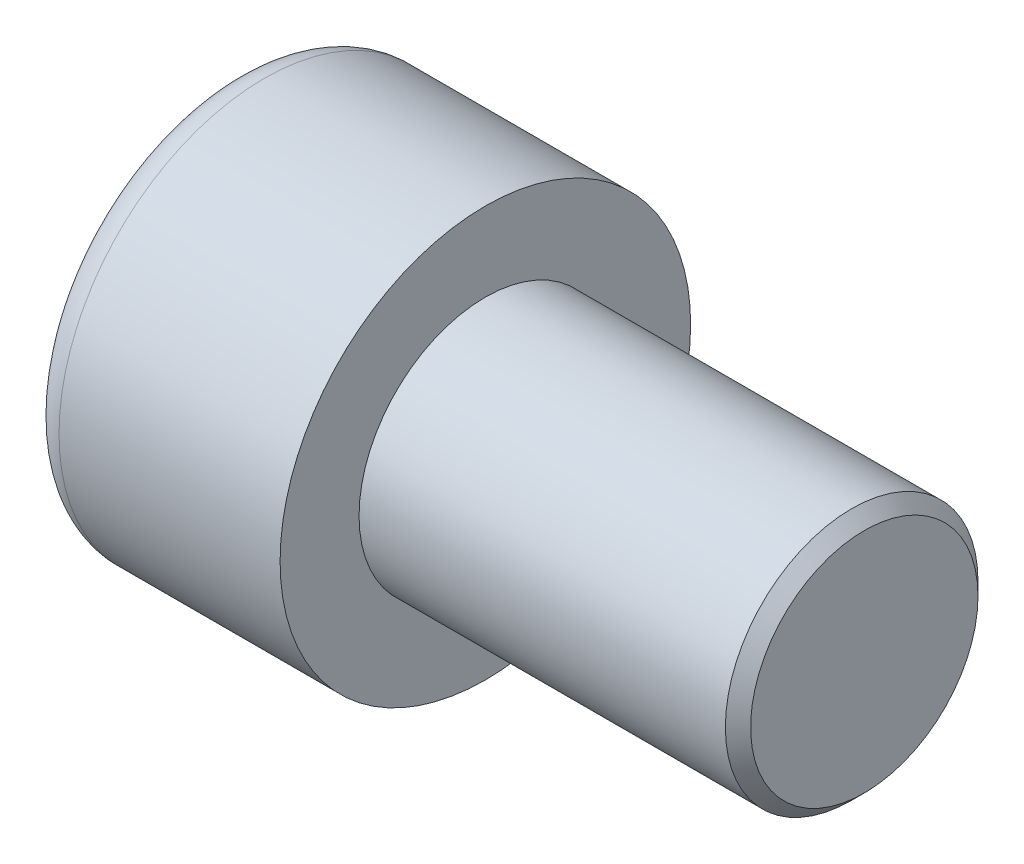
ISO-10303-21;
HEADER;
FILE_DESCRIPTION(('STEP AP214'),'2;1');
FILE_NAME('part.step','',(''),(''),'','','');
FILE_SCHEMA(('AUTOMOTIVE_DESIGN { 1 0 10303 214 1 1 1 1 }'));
ENDSEC;
DATA;
#1=APPLICATION_CONTEXT('core data for automotive mechanical design processes');
#2=APPLICATION_PROTOCOL_DEFINITION('international standard','automotive_design',2000,#1);
#3=PRODUCT_CONTEXT('',#1,'mechanical');
#4=PRODUCT('Part','Part','',(#3));
#5=PRODUCT_RELATED_PRODUCT_CATEGORY('part','',(#4));
#6=PRODUCT_DEFINITION_FORMATION('','',#4);
#7=PRODUCT_DEFINITION_CONTEXT('part definition',#1,'design');
#8=PRODUCT_DEFINITION('design','',#6,#7);
#9=PRODUCT_DEFINITION_SHAPE('','',#8);
#10=(LENGTH_UNIT() NAMED_UNIT(*) SI_UNIT(.MILLI.,.METRE.));
#11=(NAMED_UNIT(*) PLANE_ANGLE_UNIT() SI_UNIT($,.RADIAN.));
#12=(NAMED_UNIT(*) SI_UNIT($,.STERADIAN.) SOLID_ANGLE_UNIT());
#13=UNCERTAINTY_MEASURE_WITH_UNIT(LENGTH_MEASURE(1.E-05),#10,'distance_accuracy_value','');
#14=(GEOMETRIC_REPRESENTATION_CONTEXT(3) GLOBAL_UNCERTAINTY_ASSIGNED_CONTEXT((#13)) GLOBAL_UNIT_ASSIGNED_CONTEXT((#10,
#11,#12)) REPRESENTATION_CONTEXT('',''));
#15=CARTESIAN_POINT('',(0.,0.,0.));
#16=DIRECTION('',(0.,0.,1.));
#17=DIRECTION('',(1.,0.,0.));
#18=AXIS2_PLACEMENT_3D('',#15,#16,#17);
#19=CARTESIAN_POINT('',(4.,0.,-3.46410161513776));
#20=DIRECTION('',(1.,0.,0.));
#21=DIRECTION('',(0.,0.,-1.));
#22=AXIS2_PLACEMENT_3D('',#19,#20,#21);
#23=PLANE('',#22);
#24=CARTESIAN_POINT('',(4.,0.,0.));
#25=DIRECTION('',(1.,0.,0.));
#26=DIRECTION('',(0.,0.,-1.));
#27=AXIS2_PLACEMENT_3D('',#24,#25,#26);
#28=CIRCLE('',#27,3.);
#29=CARTESIAN_POINT('',(4.,-1.5,-2.59807621135332));
#30=VERTEX_POINT('',#29);
#31=CARTESIAN_POINT('',(4.,-3.,0.));
#32=VERTEX_POINT('',#31);
#33=EDGE_CURVE('E170',#30,#32,#28,.F.);
#34=ORIENTED_EDGE('',*,*,#33,.F.);
#35=DIRECTION('',(0.,0.866025403784439,-0.5));
#36=VECTOR('',#35,1.);
#37=CARTESIAN_POINT('',(4.,-3.,-1.73205080756888));
#38=LINE('',#37,#36);
#39=CARTESIAN_POINT('',(4.,-3.,-1.73205080756888));
#40=VERTEX_POINT('',#39);
#41=EDGE_CURVE('E177',#40,#30,#38,.T.);
#42=ORIENTED_EDGE('',*,*,#41,.F.);
#43=DIRECTION('',(0.,0.,-1.));
#44=VECTOR('',#43,1.);
#45=CARTESIAN_POINT('',(4.,-3.,1.73205080756888));
#46=LINE('',#45,#44);
#47=EDGE_CURVE('E193',#32,#40,#46,.T.);
#48=ORIENTED_EDGE('',*,*,#47,.F.);
#49=EDGE_LOOP('',(#34,#42,#48));
#50=FACE_BOUND('',#49,.T.);
#51=ADVANCED_FACE('F43',(#50),#23,.F.);
#52=CARTESIAN_POINT('',(4.,-1.5,2.59807621135332));
#53=VERTEX_POINT('',#52);
#54=EDGE_CURVE('E298',#32,#53,#28,.F.);
#55=ORIENTED_EDGE('',*,*,#54,.F.);
#56=CARTESIAN_POINT('',(4.,-3.,1.73205080756888));
#57=VERTEX_POINT('',#56);
#58=EDGE_CURVE('E192',#57,#32,#46,.T.);
#59=ORIENTED_EDGE('',*,*,#58,.F.);
#60=DIRECTION('',(0.,-0.866025403784438,-0.5));
#61=VECTOR('',#60,1.);
#62=CARTESIAN_POINT('',(4.,0.,3.46410161513775));
#63=LINE('',#62,#61);
#64=EDGE_CURVE('E189',#53,#57,#63,.T.);
#65=ORIENTED_EDGE('',*,*,#64,.F.);
#66=EDGE_LOOP('',(#55,#59,#65));
#67=FACE_BOUND('',#66,.T.);
#68=ADVANCED_FACE('F134',(#67),#23,.F.);
#69=CARTESIAN_POINT('',(4.,1.5,2.59807621135332));
#70=VERTEX_POINT('',#69);
#71=EDGE_CURVE('E291',#53,#70,#28,.F.);
#72=ORIENTED_EDGE('',*,*,#71,.F.);
#73=CARTESIAN_POINT('',(4.,0.,3.46410161513775));
#74=VERTEX_POINT('',#73);
#75=EDGE_CURVE('E187',#74,#53,#63,.T.);
#76=ORIENTED_EDGE('',*,*,#75,.F.);
#77=DIRECTION('',(0.,-0.866025403784439,0.5));
#78=VECTOR('',#77,1.);
#79=CARTESIAN_POINT('',(4.,3.,1.73205080756888));
#80=LINE('',#79,#78);
#81=EDGE_CURVE('E184',#70,#74,#80,.T.);
#82=ORIENTED_EDGE('',*,*,#81,.F.);
#83=EDGE_LOOP('',(#72,#76,#82));
#84=FACE_BOUND('',#83,.T.);
#85=ADVANCED_FACE('F138',(#84),#23,.F.);
#86=CARTESIAN_POINT('',(4.,3.,0.));
#87=VERTEX_POINT('',#86);
#88=EDGE_CURVE('E163',#70,#87,#28,.F.);
#89=ORIENTED_EDGE('',*,*,#88,.F.);
#90=CARTESIAN_POINT('',(4.,3.,1.73205080756888));
#91=VERTEX_POINT('',#90);
#92=EDGE_CURVE('E188',#91,#70,#80,.T.);
#93=ORIENTED_EDGE('',*,*,#92,.F.);
#94=DIRECTION('',(0.,0.,1.));
#95=VECTOR('',#94,1.);
#96=CARTESIAN_POINT('',(4.,3.,-1.73205080756888));
#97=LINE('',#96,#95);
#98=EDGE_CURVE('E178',#87,#91,#97,.T.);
#99=ORIENTED_EDGE('',*,*,#98,.F.);
#100=EDGE_LOOP('',(#89,#93,#99));
#101=FACE_BOUND('',#100,.T.);
#102=ADVANCED_FACE('F151',(#101),#23,.F.);
#103=CARTESIAN_POINT('',(4.,0.,0.));
#104=DIRECTION('',(1.,0.,0.));
#105=DIRECTION('',(0.,0.,-1.));
#106=AXIS2_PLACEMENT_3D('',#103,#104,#105);
#107=CIRCLE('',#106,3.);
#108=CARTESIAN_POINT('',(4.,1.5,-2.59807621135332));
#109=VERTEX_POINT('',#108);
#110=EDGE_CURVE('E59',#109,#87,#107,.T.);
#111=ORIENTED_EDGE('',*,*,#110,.T.);
#112=CARTESIAN_POINT('',(4.,3.,-1.73205080756888));
#113=VERTEX_POINT('',#112);
#114=EDGE_CURVE('E171',#113,#87,#97,.T.);
#115=ORIENTED_EDGE('',*,*,#114,.F.);
#116=DIRECTION('',(0.,0.866025403784438,0.5));
#117=VECTOR('',#116,1.);
#118=CARTESIAN_POINT('',(4.,0.,-3.46410161513776));
#119=LINE('',#118,#117);
#120=EDGE_CURVE('E167',#109,#113,#119,.T.);
#121=ORIENTED_EDGE('',*,*,#120,.F.);
#122=EDGE_LOOP('',(#111,#115,#121));
#123=FACE_BOUND('',#122,.T.);
#124=ADVANCED_FACE('F142',(#123),#23,.F.);
#125=EDGE_CURVE('E156',#109,#30,#28,.F.);
#126=ORIENTED_EDGE('',*,*,#125,.F.);
#127=CARTESIAN_POINT('',(4.,0.,-3.46410161513776));
#128=VERTEX_POINT('',#127);
#129=EDGE_CURVE('E162',#128,#109,#119,.T.);
#130=ORIENTED_EDGE('',*,*,#129,.F.);
#131=EDGE_CURVE('E164',#30,#128,#38,.T.);
#132=ORIENTED_EDGE('',*,*,#131,.F.);
#133=EDGE_LOOP('',(#126,#130,#132));
#134=FACE_BOUND('',#133,.T.);
#135=ADVANCED_FACE('F133',(#134),#23,.F.);
#136=CARTESIAN_POINT('',(0.,0.,0.));
#137=DIRECTION('',(1.,0.,0.));
#138=DIRECTION('',(0.,0.,-1.));
#139=AXIS2_PLACEMENT_3D('',#136,#137,#138);
#140=PLANE('',#139);
#141=CARTESIAN_POINT('',(0.,0.,0.));
#142=DIRECTION('',(1.,0.,0.));
#143=DIRECTION('',(0.,0.,-1.));
#144=AXIS2_PLACEMENT_3D('',#141,#142,#143);
#145=CIRCLE('',#144,5.5);
#146=CARTESIAN_POINT('',(0.,0.,-5.5));
#147=VERTEX_POINT('',#146);
#148=EDGE_CURVE('E231',#147,#147,#145,.F.);
#149=ORIENTED_EDGE('',*,*,#148,.T.);
#150=EDGE_LOOP('',(#149));
#151=FACE_BOUND('',#150,.T.);
#152=DIRECTION('',(0.,0.866025403784439,-0.5));
#153=VECTOR('',#152,1.);
#154=CARTESIAN_POINT('',(0.,-3.,-1.73205080756888));
#155=LINE('',#154,#153);
#156=CARTESIAN_POINT('',(0.,-3.,-1.73205080756888));
#157=VERTEX_POINT('',#156);
#158=CARTESIAN_POINT('',(0.,0.,-3.46410161513776));
#159=VERTEX_POINT('',#158);
#160=EDGE_CURVE('E69',#157,#159,#155,.T.);
#161=ORIENTED_EDGE('',*,*,#160,.T.);
#162=DIRECTION('',(0.,0.866025403784438,0.5));
#163=VECTOR('',#162,1.);
#164=CARTESIAN_POINT('',(0.,0.,-3.46410161513776));
#165=LINE('',#164,#163);
#166=CARTESIAN_POINT('',(0.,3.,-1.73205080756888));
#167=VERTEX_POINT('',#166);
#168=EDGE_CURVE('E197',#159,#167,#165,.T.);
#169=ORIENTED_EDGE('',*,*,#168,.T.);
#170=DIRECTION('',(0.,0.,1.));
#171=VECTOR('',#170,1.);
#172=CARTESIAN_POINT('',(0.,3.,-1.73205080756888));
#173=LINE('',#172,#171);
#174=CARTESIAN_POINT('',(0.,3.,1.73205080756888));
#175=VERTEX_POINT('',#174);
#176=EDGE_CURVE('E205',#167,#175,#173,.T.);
#177=ORIENTED_EDGE('',*,*,#176,.T.);
#178=DIRECTION('',(0.,-0.866025403784439,0.5));
#179=VECTOR('',#178,1.);
#180=CARTESIAN_POINT('',(0.,3.,1.73205080756888));
#181=LINE('',#180,#179);
#182=CARTESIAN_POINT('',(0.,0.,3.46410161513775));
#183=VERTEX_POINT('',#182);
#184=EDGE_CURVE('E204',#175,#183,#181,.T.);
#185=ORIENTED_EDGE('',*,*,#184,.T.);
#186=DIRECTION('',(0.,-0.866025403784438,-0.5));
#187=VECTOR('',#186,1.);
#188=CARTESIAN_POINT('',(0.,0.,3.46410161513775));
#189=LINE('',#188,#187);
#190=CARTESIAN_POINT('',(0.,-3.,1.73205080756888));
#191=VERTEX_POINT('',#190);
#192=EDGE_CURVE('E209',#183,#191,#189,.T.);
#193=ORIENTED_EDGE('',*,*,#192,.T.);
#194=DIRECTION('',(0.,0.,-1.));
#195=VECTOR('',#194,1.);
#196=CARTESIAN_POINT('',(0.,-3.,1.73205080756888));
#197=LINE('',#196,#195);
#198=EDGE_CURVE('E212',#191,#157,#197,.T.);
#199=ORIENTED_EDGE('',*,*,#198,.T.);
#200=EDGE_LOOP('',(#161,#169,#177,#185,#193,#199));
#201=FACE_BOUND('',#200,.T.);
#202=ADVANCED_FACE('F143',(#151,#201),#140,.F.);
#203=CARTESIAN_POINT('',(8.,0.,0.));
#204=DIRECTION('',(1.,0.,0.));
#205=DIRECTION('',(0.,0.,-1.));
#206=AXIS2_PLACEMENT_3D('',#203,#204,#205);
#207=PLANE('',#206);
#208=CARTESIAN_POINT('',(8.,0.,0.));
#209=DIRECTION('',(1.,0.,0.));
#210=DIRECTION('',(0.,0.,-1.));
#211=AXIS2_PLACEMENT_3D('',#208,#209,#210);
#212=CIRCLE('',#211,6.5);
#213=CARTESIAN_POINT('',(8.,0.,-6.5));
#214=VERTEX_POINT('',#213);
#215=EDGE_CURVE('E169',#214,#214,#212,.T.);
#216=ORIENTED_EDGE('',*,*,#215,.T.);
#217=EDGE_LOOP('',(#216));
#218=FACE_BOUND('',#217,.T.);
#219=CARTESIAN_POINT('',(8.,0.,0.));
#220=DIRECTION('',(1.,0.,0.));
#221=DIRECTION('',(0.,0.,-1.));
#222=AXIS2_PLACEMENT_3D('',#219,#220,#221);
#223=CIRCLE('',#222,4.);
#224=CARTESIAN_POINT('',(8.,0.,-4.));
#225=VERTEX_POINT('',#224);
#226=EDGE_CURVE('E222',#225,#225,#223,.T.);
#227=ORIENTED_EDGE('',*,*,#226,.F.);
#228=EDGE_LOOP('',(#227));
#229=FACE_BOUND('',#228,.T.);
#230=ADVANCED_FACE('F152',(#218,#229),#207,.T.);
#231=CARTESIAN_POINT('',(8.,0.,0.));
#232=DIRECTION('',(-1.,0.,0.));
#233=DIRECTION('',(0.,0.,1.));
#234=AXIS2_PLACEMENT_3D('',#231,#232,#233);
#235=CYLINDRICAL_SURFACE('',#234,6.5);
#236=CARTESIAN_POINT('',(1.,0.,0.));
#237=DIRECTION('',(1.,0.,0.));
#238=DIRECTION('',(0.,0.,-1.));
#239=AXIS2_PLACEMENT_3D('',#236,#237,#238);
#240=CIRCLE('',#239,6.5);
#241=CARTESIAN_POINT('',(1.,0.,-6.5));
#242=VERTEX_POINT('',#241);
#243=EDGE_CURVE('E228',#242,#242,#240,.T.);
#244=ORIENTED_EDGE('',*,*,#243,.T.);
#245=EDGE_LOOP('',(#244));
#246=FACE_BOUND('',#245,.T.);
#247=ORIENTED_EDGE('',*,*,#215,.F.);
#248=EDGE_LOOP('',(#247));
#249=FACE_BOUND('',#248,.T.);
#250=ADVANCED_FACE('F249',(#246,#249),#235,.T.);
#251=CARTESIAN_POINT('',(20.,0.,0.));
#252=DIRECTION('',(-1.,0.,0.));
#253=DIRECTION('',(0.,0.,1.));
#254=AXIS2_PLACEMENT_3D('',#251,#252,#253);
#255=CYLINDRICAL_SURFACE('',#254,4.);
#256=CARTESIAN_POINT('',(19.6,0.,0.));
#257=DIRECTION('',(1.,0.,0.));
#258=DIRECTION('',(0.,0.,-1.));
#259=AXIS2_PLACEMENT_3D('',#256,#257,#258);
#260=CIRCLE('',#259,4.);
#261=CARTESIAN_POINT('',(19.6,0.,-4.));
#262=VERTEX_POINT('',#261);
#263=EDGE_CURVE('E11',#262,#262,#260,.F.);
#264=ORIENTED_EDGE('',*,*,#263,.T.);
#265=EDGE_LOOP('',(#264));
#266=FACE_BOUND('',#265,.T.);
#267=ORIENTED_EDGE('',*,*,#226,.T.);
#268=EDGE_LOOP('',(#267));
#269=FACE_BOUND('',#268,.T.);
#270=ADVANCED_FACE('F250',(#266,#269),#255,.T.);
#271=CARTESIAN_POINT('',(20.,0.,0.));
#272=DIRECTION('',(1.,0.,0.));
#273=DIRECTION('',(0.,0.,-1.));
#274=AXIS2_PLACEMENT_3D('',#271,#272,#273);
#275=PLANE('',#274);
#276=CARTESIAN_POINT('',(20.,0.,0.));
#277=DIRECTION('',(1.,0.,0.));
#278=DIRECTION('',(0.,0.,-1.));
#279=AXIS2_PLACEMENT_3D('',#276,#277,#278);
#280=CIRCLE('',#279,3.6);
#281=CARTESIAN_POINT('',(20.,0.,-3.6));
#282=VERTEX_POINT('',#281);
#283=EDGE_CURVE('E51',#282,#282,#280,.T.);
#284=ORIENTED_EDGE('',*,*,#283,.T.);
#285=EDGE_LOOP('',(#284));
#286=FACE_BOUND('',#285,.T.);
#287=ADVANCED_FACE('F239',(#286),#275,.T.);
#288=CARTESIAN_POINT('',(4.,-3.,-1.73205080756888));
#289=DIRECTION('',(0.,0.5,0.866025403784439));
#290=DIRECTION('',(0.,-0.866025403784439,0.5));
#291=AXIS2_PLACEMENT_3D('',#288,#289,#290);
#292=PLANE('',#291);
#293=ORIENTED_EDGE('',*,*,#160,.F.);
#294=DIRECTION('',(-1.,0.,0.));
#295=VECTOR('',#294,1.);
#296=CARTESIAN_POINT('',(4.,-3.,-1.73205080756888));
#297=LINE('',#296,#295);
#298=EDGE_CURVE('E200',#40,#157,#297,.T.);
#299=ORIENTED_EDGE('',*,*,#298,.F.);
#300=ORIENTED_EDGE('',*,*,#41,.T.);
#301=ORIENTED_EDGE('',*,*,#131,.T.);
#302=DIRECTION('',(-1.,0.,0.));
#303=VECTOR('',#302,1.);
#304=CARTESIAN_POINT('',(4.,0.,-3.46410161513776));
#305=LINE('',#304,#303);
#306=EDGE_CURVE('E176',#128,#159,#305,.T.);
#307=ORIENTED_EDGE('',*,*,#306,.T.);
#308=EDGE_LOOP('',(#293,#299,#300,#301,#307));
#309=FACE_BOUND('',#308,.T.);
#310=ADVANCED_FACE('F261',(#309),#292,.T.);
#311=CARTESIAN_POINT('',(4.,0.,-3.46410161513776));
#312=DIRECTION('',(0.,-0.5,0.866025403784438));
#313=DIRECTION('',(0.,-0.866025403784439,-0.5));
#314=AXIS2_PLACEMENT_3D('',#311,#312,#313);
#315=PLANE('',#314);
#316=ORIENTED_EDGE('',*,*,#168,.F.);
#317=ORIENTED_EDGE('',*,*,#306,.F.);
#318=ORIENTED_EDGE('',*,*,#129,.T.);
#319=ORIENTED_EDGE('',*,*,#120,.T.);
#320=DIRECTION('',(-1.,0.,0.));
#321=VECTOR('',#320,1.);
#322=CARTESIAN_POINT('',(4.,3.,-1.73205080756888));
#323=LINE('',#322,#321);
#324=EDGE_CURVE('E223',#113,#167,#323,.T.);
#325=ORIENTED_EDGE('',*,*,#324,.T.);
#326=EDGE_LOOP('',(#316,#317,#318,#319,#325));
#327=FACE_BOUND('',#326,.T.);
#328=ADVANCED_FACE('F180',(#327),#315,.T.);
#329=CARTESIAN_POINT('',(4.,3.,-1.73205080756888));
#330=DIRECTION('',(0.,-1.,0.));
#331=DIRECTION('',(0.,0.,-1.));
#332=AXIS2_PLACEMENT_3D('',#329,#330,#331);
#333=PLANE('',#332);
#334=ORIENTED_EDGE('',*,*,#176,.F.);
#335=ORIENTED_EDGE('',*,*,#324,.F.);
#336=ORIENTED_EDGE('',*,*,#114,.T.);
#337=ORIENTED_EDGE('',*,*,#98,.T.);
#338=DIRECTION('',(-1.,0.,0.));
#339=VECTOR('',#338,1.);
#340=CARTESIAN_POINT('',(4.,3.,1.73205080756888));
#341=LINE('',#340,#339);
#342=EDGE_CURVE('E218',#91,#175,#341,.T.);
#343=ORIENTED_EDGE('',*,*,#342,.T.);
#344=EDGE_LOOP('',(#334,#335,#336,#337,#343));
#345=FACE_BOUND('',#344,.T.);
#346=ADVANCED_FACE('F270',(#345),#333,.T.);
#347=CARTESIAN_POINT('',(4.,3.,1.73205080756888));
#348=DIRECTION('',(0.,-0.5,-0.866025403784439));
#349=DIRECTION('',(0.,0.866025403784439,-0.5));
#350=AXIS2_PLACEMENT_3D('',#347,#348,#349);
#351=PLANE('',#350);
#352=ORIENTED_EDGE('',*,*,#184,.F.);
#353=ORIENTED_EDGE('',*,*,#342,.F.);
#354=ORIENTED_EDGE('',*,*,#92,.T.);
#355=ORIENTED_EDGE('',*,*,#81,.T.);
#356=DIRECTION('',(-1.,0.,0.));
#357=VECTOR('',#356,1.);
#358=CARTESIAN_POINT('',(4.,0.,3.46410161513775));
#359=LINE('',#358,#357);
#360=EDGE_CURVE('E216',#74,#183,#359,.T.);
#361=ORIENTED_EDGE('',*,*,#360,.T.);
#362=EDGE_LOOP('',(#352,#353,#354,#355,#361));
#363=FACE_BOUND('',#362,.T.);
#364=ADVANCED_FACE('F269',(#363),#351,.T.);
#365=CARTESIAN_POINT('',(4.,0.,3.46410161513775));
#366=DIRECTION('',(0.,0.5,-0.866025403784439));
#367=DIRECTION('',(0.,0.866025403784439,0.5));
#368=AXIS2_PLACEMENT_3D('',#365,#366,#367);
#369=PLANE('',#368);
#370=ORIENTED_EDGE('',*,*,#192,.F.);
#371=ORIENTED_EDGE('',*,*,#360,.F.);
#372=ORIENTED_EDGE('',*,*,#75,.T.);
#373=ORIENTED_EDGE('',*,*,#64,.T.);
#374=DIRECTION('',(-1.,0.,0.));
#375=VECTOR('',#374,1.);
#376=CARTESIAN_POINT('',(4.,-3.,1.73205080756888));
#377=LINE('',#376,#375);
#378=EDGE_CURVE('E213',#57,#191,#377,.T.);
#379=ORIENTED_EDGE('',*,*,#378,.T.);
#380=EDGE_LOOP('',(#370,#371,#372,#373,#379));
#381=FACE_BOUND('',#380,.T.);
#382=ADVANCED_FACE('F127',(#381),#369,.T.);
#383=CARTESIAN_POINT('',(4.,-3.,1.73205080756888));
#384=DIRECTION('',(0.,1.,0.));
#385=DIRECTION('',(0.,0.,1.));
#386=AXIS2_PLACEMENT_3D('',#383,#384,#385);
#387=PLANE('',#386);
#388=ORIENTED_EDGE('',*,*,#198,.F.);
#389=ORIENTED_EDGE('',*,*,#378,.F.);
#390=ORIENTED_EDGE('',*,*,#58,.T.);
#391=ORIENTED_EDGE('',*,*,#47,.T.);
#392=ORIENTED_EDGE('',*,*,#298,.T.);
#393=EDGE_LOOP('',(#388,#389,#390,#391,#392));
#394=FACE_BOUND('',#393,.T.);
#395=ADVANCED_FACE('F119',(#394),#387,.T.);
#396=CARTESIAN_POINT('',(4.,0.,0.));
#397=DIRECTION('',(-1.,0.,0.));
#398=DIRECTION('',(0.,0.,1.));
#399=AXIS2_PLACEMENT_3D('',#396,#397,#398);
#400=CONICAL_SURFACE('',#399,3.,1.04719755119659);
#401=CARTESIAN_POINT('',(5.7320508075689,0.,0.));
#402=VERTEX_POINT('',#401);
#403=VERTEX_LOOP('',#402);
#404=FACE_BOUND('',#403,.T.);
#405=ORIENTED_EDGE('',*,*,#110,.F.);
#406=ORIENTED_EDGE('',*,*,#125,.T.);
#407=ORIENTED_EDGE('',*,*,#33,.T.);
#408=ORIENTED_EDGE('',*,*,#54,.T.);
#409=ORIENTED_EDGE('',*,*,#71,.T.);
#410=ORIENTED_EDGE('',*,*,#88,.T.);
#411=EDGE_LOOP('',(#405,#406,#407,#408,#409,#410));
#412=FACE_BOUND('',#411,.T.);
#413=ADVANCED_FACE('F120',(#404,#412),#400,.F.);
#414=CARTESIAN_POINT('',(1.,0.,0.));
#415=DIRECTION('',(1.,0.,0.));
#416=DIRECTION('',(0.,0.,-1.));
#417=AXIS2_PLACEMENT_3D('',#414,#415,#416);
#418=TOROIDAL_SURFACE('',#417,5.5,1.);
#419=ORIENTED_EDGE('',*,*,#148,.F.);
#420=EDGE_LOOP('',(#419));
#421=FACE_BOUND('',#420,.T.);
#422=ORIENTED_EDGE('',*,*,#243,.F.);
#423=EDGE_LOOP('',(#422));
#424=FACE_BOUND('',#423,.T.);
#425=ADVANCED_FACE('F117',(#421,#424),#418,.T.);
#426=CARTESIAN_POINT('',(20.,0.,0.));
#427=DIRECTION('',(-1.,0.,0.));
#428=DIRECTION('',(0.,0.,1.));
#429=AXIS2_PLACEMENT_3D('',#426,#427,#428);
#430=CONICAL_SURFACE('',#429,3.6,0.785398163397448);
#431=ORIENTED_EDGE('',*,*,#263,.F.);
#432=EDGE_LOOP('',(#431));
#433=FACE_BOUND('',#432,.T.);
#434=ORIENTED_EDGE('',*,*,#283,.F.);
#435=EDGE_LOOP('',(#434));
#436=FACE_BOUND('',#435,.T.);
#437=ADVANCED_FACE('F44',(#433,#436),#430,.T.);
#438=CLOSED_SHELL('',(#51,#68,#85,#102,#124,#135,#202,#230,#250,#270,#287,#310,#328,#346,#364,
#382,#395,#413,#425,#437));
#439=MANIFOLD_SOLID_BREP('B2',#438);
#440=ADVANCED_BREP_SHAPE_REPRESENTATION('',(#18,#439),#14);
#441=SHAPE_DEFINITION_REPRESENTATION(#9,#440);
ENDSEC;
END-ISO-10303-21;
